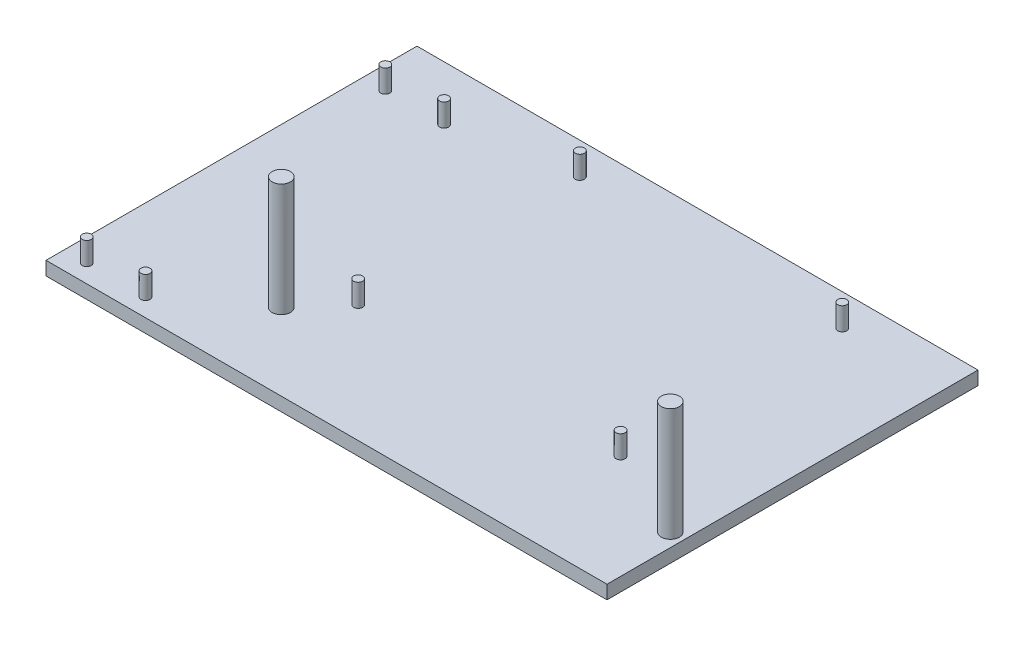
ISO-10303-21;
HEADER;
FILE_DESCRIPTION(('STEP AP214'),'2;1');
FILE_NAME('part.step','',(''),(''),'','','');
FILE_SCHEMA(('AUTOMOTIVE_DESIGN { 1 0 10303 214 1 1 1 1 }'));
ENDSEC;
DATA;
#1=APPLICATION_CONTEXT('core data for automotive mechanical design processes');
#2=APPLICATION_PROTOCOL_DEFINITION('international standard','automotive_design',2000,#1);
#3=PRODUCT_CONTEXT('',#1,'mechanical');
#4=PRODUCT('Part','Part','',(#3));
#5=PRODUCT_RELATED_PRODUCT_CATEGORY('part','',(#4));
#6=PRODUCT_DEFINITION_FORMATION('','',#4);
#7=PRODUCT_DEFINITION_CONTEXT('part definition',#1,'design');
#8=PRODUCT_DEFINITION('design','',#6,#7);
#9=PRODUCT_DEFINITION_SHAPE('','',#8);
#10=(LENGTH_UNIT() NAMED_UNIT(*) SI_UNIT(.MILLI.,.METRE.));
#11=(NAMED_UNIT(*) PLANE_ANGLE_UNIT() SI_UNIT($,.RADIAN.));
#12=(NAMED_UNIT(*) SI_UNIT($,.STERADIAN.) SOLID_ANGLE_UNIT());
#13=UNCERTAINTY_MEASURE_WITH_UNIT(LENGTH_MEASURE(1.E-05),#10,'distance_accuracy_value','');
#14=(GEOMETRIC_REPRESENTATION_CONTEXT(3) GLOBAL_UNCERTAINTY_ASSIGNED_CONTEXT((#13)) GLOBAL_UNIT_ASSIGNED_CONTEXT((#10,
#11,#12)) REPRESENTATION_CONTEXT('',''));
#15=CARTESIAN_POINT('',(0.,0.,0.));
#16=DIRECTION('',(0.,0.,1.));
#17=DIRECTION('',(1.,0.,0.));
#18=AXIS2_PLACEMENT_3D('',#15,#16,#17);
#19=CARTESIAN_POINT('',(-62.,3.,41.));
#20=DIRECTION('',(1.,0.,0.));
#21=DIRECTION('',(0.,0.,-1.));
#22=AXIS2_PLACEMENT_3D('',#19,#20,#21);
#23=PLANE('',#22);
#24=DIRECTION('',(0.,0.,1.));
#25=VECTOR('',#24,1.);
#26=CARTESIAN_POINT('',(-62.,0.,41.));
#27=LINE('',#26,#25);
#28=CARTESIAN_POINT('',(-62.,0.,-41.));
#29=VERTEX_POINT('',#28);
#30=CARTESIAN_POINT('',(-62.,0.,41.));
#31=VERTEX_POINT('',#30);
#32=EDGE_CURVE('E117',#29,#31,#27,.T.);
#33=ORIENTED_EDGE('',*,*,#32,.T.);
#34=DIRECTION('',(0.,-1.,0.));
#35=VECTOR('',#34,1.);
#36=CARTESIAN_POINT('',(-62.,3.,41.));
#37=LINE('',#36,#35);
#38=CARTESIAN_POINT('',(-62.,3.,41.));
#39=VERTEX_POINT('',#38);
#40=EDGE_CURVE('E106',#39,#31,#37,.T.);
#41=ORIENTED_EDGE('',*,*,#40,.F.);
#42=DIRECTION('',(0.,0.,1.));
#43=VECTOR('',#42,1.);
#44=CARTESIAN_POINT('',(-62.,3.,41.));
#45=LINE('',#44,#43);
#46=CARTESIAN_POINT('',(-62.,3.,-41.));
#47=VERTEX_POINT('',#46);
#48=EDGE_CURVE('E98',#47,#39,#45,.T.);
#49=ORIENTED_EDGE('',*,*,#48,.F.);
#50=DIRECTION('',(0.,-1.,0.));
#51=VECTOR('',#50,1.);
#52=CARTESIAN_POINT('',(-62.,3.,-41.));
#53=LINE('',#52,#51);
#54=EDGE_CURVE('E113',#47,#29,#53,.T.);
#55=ORIENTED_EDGE('',*,*,#54,.T.);
#56=EDGE_LOOP('',(#33,#41,#49,#55));
#57=FACE_BOUND('',#56,.T.);
#58=ADVANCED_FACE('F45',(#57),#23,.F.);
#59=CARTESIAN_POINT('',(62.,3.,41.));
#60=DIRECTION('',(0.,0.,-1.));
#61=DIRECTION('',(-1.,0.,0.));
#62=AXIS2_PLACEMENT_3D('',#59,#60,#61);
#63=PLANE('',#62);
#64=DIRECTION('',(1.,0.,0.));
#65=VECTOR('',#64,1.);
#66=CARTESIAN_POINT('',(62.,0.,41.));
#67=LINE('',#66,#65);
#68=CARTESIAN_POINT('',(62.,0.,41.));
#69=VERTEX_POINT('',#68);
#70=EDGE_CURVE('E104',#31,#69,#67,.T.);
#71=ORIENTED_EDGE('',*,*,#70,.T.);
#72=DIRECTION('',(0.,-1.,0.));
#73=VECTOR('',#72,1.);
#74=CARTESIAN_POINT('',(62.,3.,41.));
#75=LINE('',#74,#73);
#76=CARTESIAN_POINT('',(62.,3.,41.));
#77=VERTEX_POINT('',#76);
#78=EDGE_CURVE('E102',#77,#69,#75,.T.);
#79=ORIENTED_EDGE('',*,*,#78,.F.);
#80=DIRECTION('',(1.,0.,0.));
#81=VECTOR('',#80,1.);
#82=CARTESIAN_POINT('',(62.,3.,41.));
#83=LINE('',#82,#81);
#84=EDGE_CURVE('E93',#39,#77,#83,.T.);
#85=ORIENTED_EDGE('',*,*,#84,.F.);
#86=ORIENTED_EDGE('',*,*,#40,.T.);
#87=EDGE_LOOP('',(#71,#79,#85,#86));
#88=FACE_BOUND('',#87,.T.);
#89=ADVANCED_FACE('F103',(#88),#63,.F.);
#90=CARTESIAN_POINT('',(62.,3.,-41.));
#91=DIRECTION('',(-1.,0.,0.));
#92=DIRECTION('',(0.,0.,1.));
#93=AXIS2_PLACEMENT_3D('',#90,#91,#92);
#94=PLANE('',#93);
#95=DIRECTION('',(0.,0.,-1.));
#96=VECTOR('',#95,1.);
#97=CARTESIAN_POINT('',(62.,0.,-41.));
#98=LINE('',#97,#96);
#99=CARTESIAN_POINT('',(62.,0.,-41.));
#100=VERTEX_POINT('',#99);
#101=EDGE_CURVE('E79',#69,#100,#98,.T.);
#102=ORIENTED_EDGE('',*,*,#101,.T.);
#103=DIRECTION('',(0.,-1.,0.));
#104=VECTOR('',#103,1.);
#105=CARTESIAN_POINT('',(62.,3.,-41.));
#106=LINE('',#105,#104);
#107=CARTESIAN_POINT('',(62.,3.,-41.));
#108=VERTEX_POINT('',#107);
#109=EDGE_CURVE('E107',#108,#100,#106,.T.);
#110=ORIENTED_EDGE('',*,*,#109,.F.);
#111=DIRECTION('',(0.,0.,-1.));
#112=VECTOR('',#111,1.);
#113=CARTESIAN_POINT('',(62.,3.,-41.));
#114=LINE('',#113,#112);
#115=EDGE_CURVE('E96',#77,#108,#114,.T.);
#116=ORIENTED_EDGE('',*,*,#115,.F.);
#117=ORIENTED_EDGE('',*,*,#78,.T.);
#118=EDGE_LOOP('',(#102,#110,#116,#117));
#119=FACE_BOUND('',#118,.T.);
#120=ADVANCED_FACE('F109',(#119),#94,.F.);
#121=CARTESIAN_POINT('',(-62.,3.,-41.));
#122=DIRECTION('',(0.,0.,1.));
#123=DIRECTION('',(1.,0.,0.));
#124=AXIS2_PLACEMENT_3D('',#121,#122,#123);
#125=PLANE('',#124);
#126=DIRECTION('',(-1.,0.,0.));
#127=VECTOR('',#126,1.);
#128=CARTESIAN_POINT('',(-62.,0.,-41.));
#129=LINE('',#128,#127);
#130=EDGE_CURVE('E85',#100,#29,#129,.T.);
#131=ORIENTED_EDGE('',*,*,#130,.T.);
#132=ORIENTED_EDGE('',*,*,#54,.F.);
#133=DIRECTION('',(-1.,0.,0.));
#134=VECTOR('',#133,1.);
#135=CARTESIAN_POINT('',(-62.,3.,-41.));
#136=LINE('',#135,#134);
#137=EDGE_CURVE('E62',#108,#47,#136,.T.);
#138=ORIENTED_EDGE('',*,*,#137,.F.);
#139=ORIENTED_EDGE('',*,*,#109,.T.);
#140=EDGE_LOOP('',(#131,#132,#138,#139));
#141=FACE_BOUND('',#140,.T.);
#142=ADVANCED_FACE('F174',(#141),#125,.F.);
#143=CARTESIAN_POINT('',(0.,3.,0.));
#144=DIRECTION('',(0.,-1.,0.));
#145=DIRECTION('',(0.,0.,-1.));
#146=AXIS2_PLACEMENT_3D('',#143,#144,#145);
#147=PLANE('',#146);
#148=CARTESIAN_POINT('',(-57.,3.,-29.));
#149=DIRECTION('',(0.,-1.,0.));
#150=DIRECTION('',(0.,0.,-1.));
#151=AXIS2_PLACEMENT_3D('',#148,#149,#150);
#152=CIRCLE('',#151,0.999999999999998);
#153=CARTESIAN_POINT('',(-57.,3.,-30.));
#154=VERTEX_POINT('',#153);
#155=EDGE_CURVE('E11',#154,#154,#152,.F.);
#156=ORIENTED_EDGE('',*,*,#155,.F.);
#157=EDGE_LOOP('',(#156));
#158=FACE_BOUND('',#157,.T.);
#159=CARTESIAN_POINT('',(-44.,3.,-29.));
#160=DIRECTION('',(0.,-1.,0.));
#161=DIRECTION('',(0.,0.,-1.));
#162=AXIS2_PLACEMENT_3D('',#159,#160,#161);
#163=CIRCLE('',#162,0.999999999999998);
#164=CARTESIAN_POINT('',(-44.,3.,-30.));
#165=VERTEX_POINT('',#164);
#166=EDGE_CURVE('E54',#165,#165,#163,.F.);
#167=ORIENTED_EDGE('',*,*,#166,.F.);
#168=EDGE_LOOP('',(#167));
#169=FACE_BOUND('',#168,.T.);
#170=CARTESIAN_POINT('',(-44.,3.,37.));
#171=DIRECTION('',(0.,-1.,0.));
#172=DIRECTION('',(0.,0.,-1.));
#173=AXIS2_PLACEMENT_3D('',#170,#171,#172);
#174=CIRCLE('',#173,0.999999999999998);
#175=CARTESIAN_POINT('',(-44.,3.,36.));
#176=VERTEX_POINT('',#175);
#177=EDGE_CURVE('E162',#176,#176,#174,.F.);
#178=ORIENTED_EDGE('',*,*,#177,.F.);
#179=EDGE_LOOP('',(#178));
#180=FACE_BOUND('',#179,.T.);
#181=CARTESIAN_POINT('',(-57.,3.,37.));
#182=DIRECTION('',(0.,-1.,0.));
#183=DIRECTION('',(0.,0.,-1.));
#184=AXIS2_PLACEMENT_3D('',#181,#182,#183);
#185=CIRCLE('',#184,0.999999999999998);
#186=CARTESIAN_POINT('',(-57.,3.,36.));
#187=VERTEX_POINT('',#186);
#188=EDGE_CURVE('E158',#187,#187,#185,.F.);
#189=ORIENTED_EDGE('',*,*,#188,.F.);
#190=EDGE_LOOP('',(#189));
#191=FACE_BOUND('',#190,.T.);
#192=CARTESIAN_POINT('',(39.,3.,15.));
#193=DIRECTION('',(0.,-1.,0.));
#194=DIRECTION('',(0.,0.,-1.));
#195=AXIS2_PLACEMENT_3D('',#192,#193,#194);
#196=CIRCLE('',#195,0.999999999999998);
#197=CARTESIAN_POINT('',(39.,3.,14.));
#198=VERTEX_POINT('',#197);
#199=EDGE_CURVE('E154',#198,#198,#196,.F.);
#200=ORIENTED_EDGE('',*,*,#199,.F.);
#201=EDGE_LOOP('',(#200));
#202=FACE_BOUND('',#201,.T.);
#203=CARTESIAN_POINT('',(-19.,3.,15.));
#204=DIRECTION('',(0.,-1.,0.));
#205=DIRECTION('',(0.,0.,-1.));
#206=AXIS2_PLACEMENT_3D('',#203,#204,#205);
#207=CIRCLE('',#206,1.);
#208=CARTESIAN_POINT('',(-19.,3.,14.));
#209=VERTEX_POINT('',#208);
#210=EDGE_CURVE('E150',#209,#209,#207,.F.);
#211=ORIENTED_EDGE('',*,*,#210,.F.);
#212=EDGE_LOOP('',(#211));
#213=FACE_BOUND('',#212,.T.);
#214=CARTESIAN_POINT('',(-19.,3.,-34.));
#215=DIRECTION('',(0.,-1.,0.));
#216=DIRECTION('',(0.,0.,-1.));
#217=AXIS2_PLACEMENT_3D('',#214,#215,#216);
#218=CIRCLE('',#217,1.);
#219=CARTESIAN_POINT('',(-19.,3.,-35.));
#220=VERTEX_POINT('',#219);
#221=EDGE_CURVE('E146',#220,#220,#218,.F.);
#222=ORIENTED_EDGE('',*,*,#221,.F.);
#223=EDGE_LOOP('',(#222));
#224=FACE_BOUND('',#223,.T.);
#225=CARTESIAN_POINT('',(39.,3.,-34.));
#226=DIRECTION('',(0.,-1.,0.));
#227=DIRECTION('',(0.,0.,-1.));
#228=AXIS2_PLACEMENT_3D('',#225,#226,#227);
#229=CIRCLE('',#228,0.999999999999998);
#230=CARTESIAN_POINT('',(39.,3.,-35.));
#231=VERTEX_POINT('',#230);
#232=EDGE_CURVE('E142',#231,#231,#229,.F.);
#233=ORIENTED_EDGE('',*,*,#232,.F.);
#234=EDGE_LOOP('',(#233));
#235=FACE_BOUND('',#234,.T.);
#236=CARTESIAN_POINT('',(59.,3.,24.));
#237=DIRECTION('',(0.,-1.,0.));
#238=DIRECTION('',(0.,0.,-1.));
#239=AXIS2_PLACEMENT_3D('',#236,#237,#238);
#240=CIRCLE('',#239,2.);
#241=CARTESIAN_POINT('',(59.,3.,22.));
#242=VERTEX_POINT('',#241);
#243=EDGE_CURVE('E138',#242,#242,#240,.F.);
#244=ORIENTED_EDGE('',*,*,#243,.F.);
#245=EDGE_LOOP('',(#244));
#246=FACE_BOUND('',#245,.T.);
#247=CARTESIAN_POINT('',(-27.,3.,24.));
#248=DIRECTION('',(0.,-1.,0.));
#249=DIRECTION('',(0.,0.,-1.));
#250=AXIS2_PLACEMENT_3D('',#247,#248,#249);
#251=CIRCLE('',#250,2.);
#252=CARTESIAN_POINT('',(-27.,3.,22.));
#253=VERTEX_POINT('',#252);
#254=EDGE_CURVE('E134',#253,#253,#251,.F.);
#255=ORIENTED_EDGE('',*,*,#254,.F.);
#256=EDGE_LOOP('',(#255));
#257=FACE_BOUND('',#256,.T.);
#258=ORIENTED_EDGE('',*,*,#48,.T.);
#259=ORIENTED_EDGE('',*,*,#84,.T.);
#260=ORIENTED_EDGE('',*,*,#115,.T.);
#261=ORIENTED_EDGE('',*,*,#137,.T.);
#262=EDGE_LOOP('',(#258,#259,#260,#261));
#263=FACE_BOUND('',#262,.T.);
#264=ADVANCED_FACE('F94',(#158,#169,#180,#191,#202,#213,#224,#235,#246,#257,#263),#147,.F.);
#265=CARTESIAN_POINT('',(0.,0.,0.));
#266=DIRECTION('',(0.,-1.,0.));
#267=DIRECTION('',(0.,0.,-1.));
#268=AXIS2_PLACEMENT_3D('',#265,#266,#267);
#269=PLANE('',#268);
#270=ORIENTED_EDGE('',*,*,#32,.F.);
#271=ORIENTED_EDGE('',*,*,#130,.F.);
#272=ORIENTED_EDGE('',*,*,#101,.F.);
#273=ORIENTED_EDGE('',*,*,#70,.F.);
#274=EDGE_LOOP('',(#270,#271,#272,#273));
#275=FACE_BOUND('',#274,.T.);
#276=ADVANCED_FACE('F173',(#275),#269,.T.);
#277=CARTESIAN_POINT('',(-27.,28.,24.));
#278=DIRECTION('',(0.,-1.,0.));
#279=DIRECTION('',(0.,0.,-1.));
#280=AXIS2_PLACEMENT_3D('',#277,#278,#279);
#281=CYLINDRICAL_SURFACE('',#280,2.);
#282=CARTESIAN_POINT('',(-27.,28.,24.));
#283=DIRECTION('',(0.,1.,0.));
#284=DIRECTION('',(0.,0.,1.));
#285=AXIS2_PLACEMENT_3D('',#282,#283,#284);
#286=CIRCLE('',#285,2.);
#287=CARTESIAN_POINT('',(-27.,28.,26.));
#288=VERTEX_POINT('',#287);
#289=EDGE_CURVE('E471',#288,#288,#286,.T.);
#290=ORIENTED_EDGE('',*,*,#289,.F.);
#291=EDGE_LOOP('',(#290));
#292=FACE_BOUND('',#291,.T.);
#293=ORIENTED_EDGE('',*,*,#254,.T.);
#294=EDGE_LOOP('',(#293));
#295=FACE_BOUND('',#294,.T.);
#296=ADVANCED_FACE('F193',(#292,#295),#281,.T.);
#297=CARTESIAN_POINT('',(-27.,28.,24.));
#298=DIRECTION('',(0.,1.,0.));
#299=DIRECTION('',(0.,0.,1.));
#300=AXIS2_PLACEMENT_3D('',#297,#298,#299);
#301=PLANE('',#300);
#302=ORIENTED_EDGE('',*,*,#289,.T.);
#303=EDGE_LOOP('',(#302));
#304=FACE_BOUND('',#303,.T.);
#305=ADVANCED_FACE('F195',(#304),#301,.T.);
#306=CARTESIAN_POINT('',(59.,28.,24.));
#307=DIRECTION('',(0.,-1.,0.));
#308=DIRECTION('',(0.,0.,-1.));
#309=AXIS2_PLACEMENT_3D('',#306,#307,#308);
#310=CYLINDRICAL_SURFACE('',#309,2.);
#311=CARTESIAN_POINT('',(59.,28.,24.));
#312=DIRECTION('',(0.,1.,0.));
#313=DIRECTION('',(0.,0.,1.));
#314=AXIS2_PLACEMENT_3D('',#311,#312,#313);
#315=CIRCLE('',#314,2.);
#316=CARTESIAN_POINT('',(59.,28.,26.));
#317=VERTEX_POINT('',#316);
#318=EDGE_CURVE('E121',#317,#317,#315,.T.);
#319=ORIENTED_EDGE('',*,*,#318,.F.);
#320=EDGE_LOOP('',(#319));
#321=FACE_BOUND('',#320,.T.);
#322=ORIENTED_EDGE('',*,*,#243,.T.);
#323=EDGE_LOOP('',(#322));
#324=FACE_BOUND('',#323,.T.);
#325=ADVANCED_FACE('F202',(#321,#324),#310,.T.);
#326=CARTESIAN_POINT('',(59.,28.,24.));
#327=DIRECTION('',(0.,1.,0.));
#328=DIRECTION('',(0.,0.,1.));
#329=AXIS2_PLACEMENT_3D('',#326,#327,#328);
#330=PLANE('',#329);
#331=ORIENTED_EDGE('',*,*,#318,.T.);
#332=EDGE_LOOP('',(#331));
#333=FACE_BOUND('',#332,.T.);
#334=ADVANCED_FACE('F265',(#333),#330,.T.);
#335=CARTESIAN_POINT('',(39.,8.,-34.));
#336=DIRECTION('',(0.,-1.,0.));
#337=DIRECTION('',(0.,0.,-1.));
#338=AXIS2_PLACEMENT_3D('',#335,#336,#337);
#339=CYLINDRICAL_SURFACE('',#338,0.999999999999998);
#340=CARTESIAN_POINT('',(39.,8.,-34.));
#341=DIRECTION('',(0.,1.,0.));
#342=DIRECTION('',(0.,0.,1.));
#343=AXIS2_PLACEMENT_3D('',#340,#341,#342);
#344=CIRCLE('',#343,0.999999999999998);
#345=CARTESIAN_POINT('',(39.,8.,-33.));
#346=VERTEX_POINT('',#345);
#347=EDGE_CURVE('E460',#346,#346,#344,.T.);
#348=ORIENTED_EDGE('',*,*,#347,.F.);
#349=EDGE_LOOP('',(#348));
#350=FACE_BOUND('',#349,.T.);
#351=ORIENTED_EDGE('',*,*,#232,.T.);
#352=EDGE_LOOP('',(#351));
#353=FACE_BOUND('',#352,.T.);
#354=ADVANCED_FACE('F273',(#350,#353),#339,.T.);
#355=CARTESIAN_POINT('',(39.,8.,-34.));
#356=DIRECTION('',(0.,1.,0.));
#357=DIRECTION('',(0.,0.,1.));
#358=AXIS2_PLACEMENT_3D('',#355,#356,#357);
#359=PLANE('',#358);
#360=ORIENTED_EDGE('',*,*,#347,.T.);
#361=EDGE_LOOP('',(#360));
#362=FACE_BOUND('',#361,.T.);
#363=ADVANCED_FACE('F282',(#362),#359,.T.);
#364=CARTESIAN_POINT('',(-19.,8.,-34.));
#365=DIRECTION('',(0.,-1.,0.));
#366=DIRECTION('',(0.,0.,-1.));
#367=AXIS2_PLACEMENT_3D('',#364,#365,#366);
#368=CYLINDRICAL_SURFACE('',#367,1.);
#369=CARTESIAN_POINT('',(-19.,8.,-34.));
#370=DIRECTION('',(0.,1.,0.));
#371=DIRECTION('',(0.,0.,1.));
#372=AXIS2_PLACEMENT_3D('',#369,#370,#371);
#373=CIRCLE('',#372,1.);
#374=CARTESIAN_POINT('',(-19.,8.,-33.));
#375=VERTEX_POINT('',#374);
#376=EDGE_CURVE('E456',#375,#375,#373,.T.);
#377=ORIENTED_EDGE('',*,*,#376,.F.);
#378=EDGE_LOOP('',(#377));
#379=FACE_BOUND('',#378,.T.);
#380=ORIENTED_EDGE('',*,*,#221,.T.);
#381=EDGE_LOOP('',(#380));
#382=FACE_BOUND('',#381,.T.);
#383=ADVANCED_FACE('F291',(#379,#382),#368,.T.);
#384=CARTESIAN_POINT('',(-19.,8.,-34.));
#385=DIRECTION('',(0.,1.,0.));
#386=DIRECTION('',(0.,0.,1.));
#387=AXIS2_PLACEMENT_3D('',#384,#385,#386);
#388=PLANE('',#387);
#389=ORIENTED_EDGE('',*,*,#376,.T.);
#390=EDGE_LOOP('',(#389));
#391=FACE_BOUND('',#390,.T.);
#392=ADVANCED_FACE('F300',(#391),#388,.T.);
#393=CARTESIAN_POINT('',(-19.,8.,15.));
#394=DIRECTION('',(0.,-1.,0.));
#395=DIRECTION('',(0.,0.,-1.));
#396=AXIS2_PLACEMENT_3D('',#393,#394,#395);
#397=CYLINDRICAL_SURFACE('',#396,1.);
#398=CARTESIAN_POINT('',(-19.,8.,15.));
#399=DIRECTION('',(0.,1.,0.));
#400=DIRECTION('',(0.,0.,1.));
#401=AXIS2_PLACEMENT_3D('',#398,#399,#400);
#402=CIRCLE('',#401,1.);
#403=CARTESIAN_POINT('',(-19.,8.,16.));
#404=VERTEX_POINT('',#403);
#405=EDGE_CURVE('E461',#404,#404,#402,.T.);
#406=ORIENTED_EDGE('',*,*,#405,.F.);
#407=EDGE_LOOP('',(#406));
#408=FACE_BOUND('',#407,.T.);
#409=ORIENTED_EDGE('',*,*,#210,.T.);
#410=EDGE_LOOP('',(#409));
#411=FACE_BOUND('',#410,.T.);
#412=ADVANCED_FACE('F309',(#408,#411),#397,.T.);
#413=CARTESIAN_POINT('',(-19.,8.,15.));
#414=DIRECTION('',(0.,1.,0.));
#415=DIRECTION('',(0.,0.,1.));
#416=AXIS2_PLACEMENT_3D('',#413,#414,#415);
#417=PLANE('',#416);
#418=ORIENTED_EDGE('',*,*,#405,.T.);
#419=EDGE_LOOP('',(#418));
#420=FACE_BOUND('',#419,.T.);
#421=ADVANCED_FACE('F318',(#420),#417,.T.);
#422=CARTESIAN_POINT('',(39.,8.,15.));
#423=DIRECTION('',(0.,-1.,0.));
#424=DIRECTION('',(0.,0.,-1.));
#425=AXIS2_PLACEMENT_3D('',#422,#423,#424);
#426=CYLINDRICAL_SURFACE('',#425,0.999999999999998);
#427=CARTESIAN_POINT('',(39.,8.,15.));
#428=DIRECTION('',(0.,1.,0.));
#429=DIRECTION('',(0.,0.,1.));
#430=AXIS2_PLACEMENT_3D('',#427,#428,#429);
#431=CIRCLE('',#430,0.999999999999998);
#432=CARTESIAN_POINT('',(39.,8.,16.));
#433=VERTEX_POINT('',#432);
#434=EDGE_CURVE('E455',#433,#433,#431,.T.);
#435=ORIENTED_EDGE('',*,*,#434,.F.);
#436=EDGE_LOOP('',(#435));
#437=FACE_BOUND('',#436,.T.);
#438=ORIENTED_EDGE('',*,*,#199,.T.);
#439=EDGE_LOOP('',(#438));
#440=FACE_BOUND('',#439,.T.);
#441=ADVANCED_FACE('F327',(#437,#440),#426,.T.);
#442=CARTESIAN_POINT('',(39.,8.,15.));
#443=DIRECTION('',(0.,1.,0.));
#444=DIRECTION('',(0.,0.,1.));
#445=AXIS2_PLACEMENT_3D('',#442,#443,#444);
#446=PLANE('',#445);
#447=ORIENTED_EDGE('',*,*,#434,.T.);
#448=EDGE_LOOP('',(#447));
#449=FACE_BOUND('',#448,.T.);
#450=ADVANCED_FACE('F336',(#449),#446,.T.);
#451=CARTESIAN_POINT('',(-57.,8.,37.));
#452=DIRECTION('',(0.,-1.,0.));
#453=DIRECTION('',(0.,0.,-1.));
#454=AXIS2_PLACEMENT_3D('',#451,#452,#453);
#455=CYLINDRICAL_SURFACE('',#454,0.999999999999998);
#456=CARTESIAN_POINT('',(-57.,8.,37.));
#457=DIRECTION('',(0.,1.,0.));
#458=DIRECTION('',(0.,0.,1.));
#459=AXIS2_PLACEMENT_3D('',#456,#457,#458);
#460=CIRCLE('',#459,0.999999999999998);
#461=CARTESIAN_POINT('',(-57.,8.,38.));
#462=VERTEX_POINT('',#461);
#463=EDGE_CURVE('E451',#462,#462,#460,.T.);
#464=ORIENTED_EDGE('',*,*,#463,.F.);
#465=EDGE_LOOP('',(#464));
#466=FACE_BOUND('',#465,.T.);
#467=ORIENTED_EDGE('',*,*,#188,.T.);
#468=EDGE_LOOP('',(#467));
#469=FACE_BOUND('',#468,.T.);
#470=ADVANCED_FACE('F345',(#466,#469),#455,.T.);
#471=CARTESIAN_POINT('',(-57.,8.,37.));
#472=DIRECTION('',(0.,1.,0.));
#473=DIRECTION('',(0.,0.,1.));
#474=AXIS2_PLACEMENT_3D('',#471,#472,#473);
#475=PLANE('',#474);
#476=ORIENTED_EDGE('',*,*,#463,.T.);
#477=EDGE_LOOP('',(#476));
#478=FACE_BOUND('',#477,.T.);
#479=ADVANCED_FACE('F354',(#478),#475,.T.);
#480=CARTESIAN_POINT('',(-44.,8.,37.));
#481=DIRECTION('',(0.,-1.,0.));
#482=DIRECTION('',(0.,0.,-1.));
#483=AXIS2_PLACEMENT_3D('',#480,#481,#482);
#484=CYLINDRICAL_SURFACE('',#483,0.999999999999998);
#485=CARTESIAN_POINT('',(-44.,8.,37.));
#486=DIRECTION('',(0.,1.,0.));
#487=DIRECTION('',(0.,0.,1.));
#488=AXIS2_PLACEMENT_3D('',#485,#486,#487);
#489=CIRCLE('',#488,0.999999999999998);
#490=CARTESIAN_POINT('',(-44.,8.,38.));
#491=VERTEX_POINT('',#490);
#492=EDGE_CURVE('E447',#491,#491,#489,.T.);
#493=ORIENTED_EDGE('',*,*,#492,.F.);
#494=EDGE_LOOP('',(#493));
#495=FACE_BOUND('',#494,.T.);
#496=ORIENTED_EDGE('',*,*,#177,.T.);
#497=EDGE_LOOP('',(#496));
#498=FACE_BOUND('',#497,.T.);
#499=ADVANCED_FACE('F363',(#495,#498),#484,.T.);
#500=CARTESIAN_POINT('',(-44.,8.,37.));
#501=DIRECTION('',(0.,1.,0.));
#502=DIRECTION('',(0.,0.,1.));
#503=AXIS2_PLACEMENT_3D('',#500,#501,#502);
#504=PLANE('',#503);
#505=ORIENTED_EDGE('',*,*,#492,.T.);
#506=EDGE_LOOP('',(#505));
#507=FACE_BOUND('',#506,.T.);
#508=ADVANCED_FACE('F372',(#507),#504,.T.);
#509=CARTESIAN_POINT('',(-44.,8.,-29.));
#510=DIRECTION('',(0.,-1.,0.));
#511=DIRECTION('',(0.,0.,-1.));
#512=AXIS2_PLACEMENT_3D('',#509,#510,#511);
#513=CYLINDRICAL_SURFACE('',#512,0.999999999999998);
#514=CARTESIAN_POINT('',(-44.,8.,-29.));
#515=DIRECTION('',(0.,1.,0.));
#516=DIRECTION('',(0.,0.,1.));
#517=AXIS2_PLACEMENT_3D('',#514,#515,#516);
#518=CIRCLE('',#517,0.999999999999998);
#519=CARTESIAN_POINT('',(-44.,8.,-28.));
#520=VERTEX_POINT('',#519);
#521=EDGE_CURVE('E443',#520,#520,#518,.T.);
#522=ORIENTED_EDGE('',*,*,#521,.F.);
#523=EDGE_LOOP('',(#522));
#524=FACE_BOUND('',#523,.T.);
#525=ORIENTED_EDGE('',*,*,#166,.T.);
#526=EDGE_LOOP('',(#525));
#527=FACE_BOUND('',#526,.T.);
#528=ADVANCED_FACE('F169',(#524,#527),#513,.T.);
#529=CARTESIAN_POINT('',(-44.,8.,-29.));
#530=DIRECTION('',(0.,1.,0.));
#531=DIRECTION('',(0.,0.,1.));
#532=AXIS2_PLACEMENT_3D('',#529,#530,#531);
#533=PLANE('',#532);
#534=ORIENTED_EDGE('',*,*,#521,.T.);
#535=EDGE_LOOP('',(#534));
#536=FACE_BOUND('',#535,.T.);
#537=ADVANCED_FACE('F389',(#536),#533,.T.);
#538=CARTESIAN_POINT('',(-57.,8.,-29.));
#539=DIRECTION('',(0.,-1.,0.));
#540=DIRECTION('',(0.,0.,-1.));
#541=AXIS2_PLACEMENT_3D('',#538,#539,#540);
#542=CYLINDRICAL_SURFACE('',#541,0.999999999999998);
#543=CARTESIAN_POINT('',(-57.,8.,-29.));
#544=DIRECTION('',(0.,1.,0.));
#545=DIRECTION('',(0.,0.,1.));
#546=AXIS2_PLACEMENT_3D('',#543,#544,#545);
#547=CIRCLE('',#546,0.999999999999998);
#548=CARTESIAN_POINT('',(-57.,8.,-28.));
#549=VERTEX_POINT('',#548);
#550=EDGE_CURVE('E441',#549,#549,#547,.T.);
#551=ORIENTED_EDGE('',*,*,#550,.F.);
#552=EDGE_LOOP('',(#551));
#553=FACE_BOUND('',#552,.T.);
#554=ORIENTED_EDGE('',*,*,#155,.T.);
#555=EDGE_LOOP('',(#554));
#556=FACE_BOUND('',#555,.T.);
#557=ADVANCED_FACE('F398',(#553,#556),#542,.T.);
#558=CARTESIAN_POINT('',(-57.,8.,-29.));
#559=DIRECTION('',(0.,1.,0.));
#560=DIRECTION('',(0.,0.,1.));
#561=AXIS2_PLACEMENT_3D('',#558,#559,#560);
#562=PLANE('',#561);
#563=ORIENTED_EDGE('',*,*,#550,.T.);
#564=EDGE_LOOP('',(#563));
#565=FACE_BOUND('',#564,.T.);
#566=ADVANCED_FACE('F407',(#565),#562,.T.);
#567=CLOSED_SHELL('',(#58,#89,#120,#142,#264,#276,#296,#305,#325,#334,#354,#363,#383,#392,#412,
#421,#441,#450,#470,#479,#499,#508,#528,#537,#557,#566));
#568=MANIFOLD_SOLID_BREP('B2',#567);
#569=ADVANCED_BREP_SHAPE_REPRESENTATION('',(#18,#568),#14);
#570=SHAPE_DEFINITION_REPRESENTATION(#9,#569);
ENDSEC;
END-ISO-10303-21;
